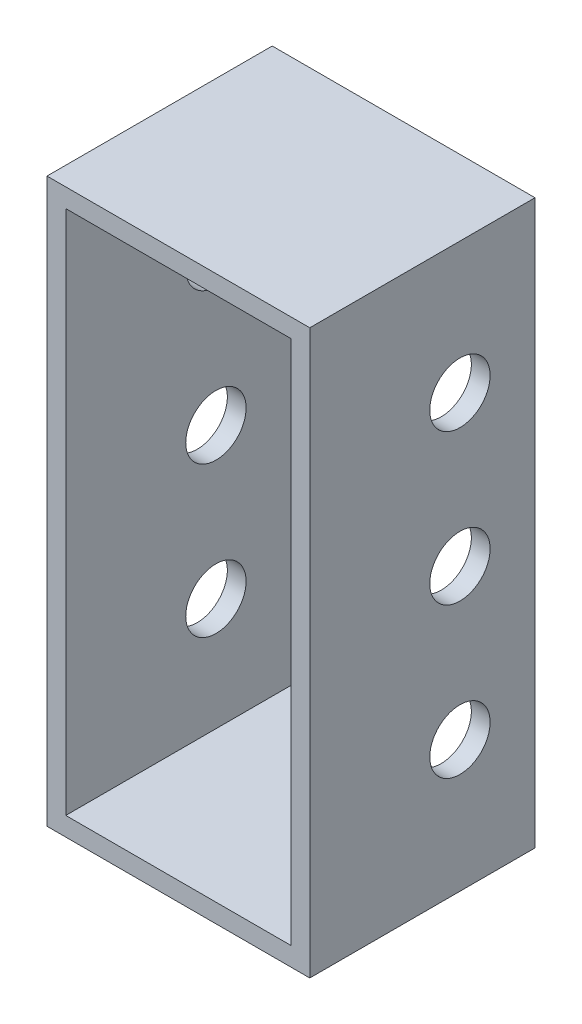
ISO-10303-21;
HEADER;
FILE_DESCRIPTION(('STEP AP214'),'2;1');
FILE_NAME('part.step','',(''),(''),'','','');
FILE_SCHEMA(('AUTOMOTIVE_DESIGN { 1 0 10303 214 1 1 1 1 }'));
ENDSEC;
DATA;
#1=APPLICATION_CONTEXT('core data for automotive mechanical design processes');
#2=APPLICATION_PROTOCOL_DEFINITION('international standard','automotive_design',2000,#1);
#3=PRODUCT_CONTEXT('',#1,'mechanical');
#4=PRODUCT('Part','Part','',(#3));
#5=PRODUCT_RELATED_PRODUCT_CATEGORY('part','',(#4));
#6=PRODUCT_DEFINITION_FORMATION('','',#4);
#7=PRODUCT_DEFINITION_CONTEXT('part definition',#1,'design');
#8=PRODUCT_DEFINITION('design','',#6,#7);
#9=PRODUCT_DEFINITION_SHAPE('','',#8);
#10=(LENGTH_UNIT() NAMED_UNIT(*) SI_UNIT(.MILLI.,.METRE.));
#11=(NAMED_UNIT(*) PLANE_ANGLE_UNIT() SI_UNIT($,.RADIAN.));
#12=(NAMED_UNIT(*) SI_UNIT($,.STERADIAN.) SOLID_ANGLE_UNIT());
#13=UNCERTAINTY_MEASURE_WITH_UNIT(LENGTH_MEASURE(1.E-05),#10,'distance_accuracy_value','');
#14=(GEOMETRIC_REPRESENTATION_CONTEXT(3) GLOBAL_UNCERTAINTY_ASSIGNED_CONTEXT((#13)) GLOBAL_UNIT_ASSIGNED_CONTEXT((#10,
#11,#12)) REPRESENTATION_CONTEXT('',''));
#15=CARTESIAN_POINT('',(0.,0.,0.));
#16=DIRECTION('',(0.,0.,1.));
#17=DIRECTION('',(1.,0.,0.));
#18=AXIS2_PLACEMENT_3D('',#15,#16,#17);
#19=CARTESIAN_POINT('',(0.,23.8125,0.));
#20=DIRECTION('',(0.,0.,-1.));
#21=DIRECTION('',(-1.,0.,0.));
#22=AXIS2_PLACEMENT_3D('',#19,#20,#21);
#23=PLANE('',#22);
#24=DIRECTION('',(1.,0.,0.));
#25=VECTOR('',#24,1.);
#26=CARTESIAN_POINT('',(0.,-23.8125,0.));
#27=LINE('',#26,#25);
#28=CARTESIAN_POINT('',(0.,-23.8125,0.));
#29=VERTEX_POINT('',#28);
#30=CARTESIAN_POINT('',(22.225,-23.8125,0.));
#31=VERTEX_POINT('',#30);
#32=EDGE_CURVE('E177',#29,#31,#27,.T.);
#33=ORIENTED_EDGE('',*,*,#32,.T.);
#34=DIRECTION('',(0.,-1.,0.));
#35=VECTOR('',#34,1.);
#36=CARTESIAN_POINT('',(22.225,23.8125,0.));
#37=LINE('',#36,#35);
#38=CARTESIAN_POINT('',(22.225,23.8125,0.));
#39=VERTEX_POINT('',#38);
#40=EDGE_CURVE('E42',#39,#31,#37,.T.);
#41=ORIENTED_EDGE('',*,*,#40,.F.);
#42=DIRECTION('',(1.,0.,0.));
#43=VECTOR('',#42,1.);
#44=CARTESIAN_POINT('',(0.,23.8125,0.));
#45=LINE('',#44,#43);
#46=CARTESIAN_POINT('',(0.,23.8125,0.));
#47=VERTEX_POINT('',#46);
#48=EDGE_CURVE('E167',#47,#39,#45,.T.);
#49=ORIENTED_EDGE('',*,*,#48,.F.);
#50=DIRECTION('',(0.,-1.,0.));
#51=VECTOR('',#50,1.);
#52=CARTESIAN_POINT('',(0.,23.8125,0.));
#53=LINE('',#52,#51);
#54=EDGE_CURVE('E11',#47,#29,#53,.T.);
#55=ORIENTED_EDGE('',*,*,#54,.T.);
#56=EDGE_LOOP('',(#33,#41,#49,#55));
#57=FACE_BOUND('',#56,.T.);
#58=DIRECTION('',(1.,0.,0.));
#59=VECTOR('',#58,1.);
#60=CARTESIAN_POINT('',(0.,-22.225,0.));
#61=LINE('',#60,#59);
#62=CARTESIAN_POINT('',(1.5875,-22.225,0.));
#63=VERTEX_POINT('',#62);
#64=CARTESIAN_POINT('',(20.6375,-22.225,0.));
#65=VERTEX_POINT('',#64);
#66=EDGE_CURVE('E112',#63,#65,#61,.T.);
#67=ORIENTED_EDGE('',*,*,#66,.F.);
#68=DIRECTION('',(0.,-1.,0.));
#69=VECTOR('',#68,1.);
#70=CARTESIAN_POINT('',(1.5875,23.8125,0.));
#71=LINE('',#70,#69);
#72=CARTESIAN_POINT('',(1.5875,22.225,0.));
#73=VERTEX_POINT('',#72);
#74=EDGE_CURVE('E99',#73,#63,#71,.T.);
#75=ORIENTED_EDGE('',*,*,#74,.F.);
#76=DIRECTION('',(1.,0.,0.));
#77=VECTOR('',#76,1.);
#78=CARTESIAN_POINT('',(0.,22.225,0.));
#79=LINE('',#78,#77);
#80=CARTESIAN_POINT('',(20.6375,22.225,0.));
#81=VERTEX_POINT('',#80);
#82=EDGE_CURVE('E126',#73,#81,#79,.T.);
#83=ORIENTED_EDGE('',*,*,#82,.T.);
#84=DIRECTION('',(0.,-1.,0.));
#85=VECTOR('',#84,1.);
#86=CARTESIAN_POINT('',(20.6375,23.8125,0.));
#87=LINE('',#86,#85);
#88=EDGE_CURVE('E108',#81,#65,#87,.T.);
#89=ORIENTED_EDGE('',*,*,#88,.T.);
#90=EDGE_LOOP('',(#67,#75,#83,#89));
#91=FACE_BOUND('',#90,.T.);
#92=ADVANCED_FACE('F34',(#57,#91),#23,.F.);
#93=CARTESIAN_POINT('',(0.,23.8125,-19.05));
#94=DIRECTION('',(0.,0.,1.));
#95=DIRECTION('',(1.,0.,0.));
#96=AXIS2_PLACEMENT_3D('',#93,#94,#95);
#97=PLANE('',#96);
#98=DIRECTION('',(-1.,0.,0.));
#99=VECTOR('',#98,1.);
#100=CARTESIAN_POINT('',(0.,-23.8125,-19.05));
#101=LINE('',#100,#99);
#102=CARTESIAN_POINT('',(22.225,-23.8125,-19.05));
#103=VERTEX_POINT('',#102);
#104=CARTESIAN_POINT('',(0.,-23.8125,-19.05));
#105=VERTEX_POINT('',#104);
#106=EDGE_CURVE('E168',#103,#105,#101,.T.);
#107=ORIENTED_EDGE('',*,*,#106,.T.);
#108=DIRECTION('',(0.,-1.,0.));
#109=VECTOR('',#108,1.);
#110=CARTESIAN_POINT('',(0.,23.8125,-19.05));
#111=LINE('',#110,#109);
#112=CARTESIAN_POINT('',(0.,23.8125,-19.05));
#113=VERTEX_POINT('',#112);
#114=EDGE_CURVE('E174',#113,#105,#111,.T.);
#115=ORIENTED_EDGE('',*,*,#114,.F.);
#116=DIRECTION('',(-1.,0.,0.));
#117=VECTOR('',#116,1.);
#118=CARTESIAN_POINT('',(0.,23.8125,-19.05));
#119=LINE('',#118,#117);
#120=CARTESIAN_POINT('',(22.225,23.8125,-19.05));
#121=VERTEX_POINT('',#120);
#122=EDGE_CURVE('E172',#121,#113,#119,.T.);
#123=ORIENTED_EDGE('',*,*,#122,.F.);
#124=DIRECTION('',(0.,-1.,0.));
#125=VECTOR('',#124,1.);
#126=CARTESIAN_POINT('',(22.225,23.8125,-19.05));
#127=LINE('',#126,#125);
#128=EDGE_CURVE('E184',#121,#103,#127,.T.);
#129=ORIENTED_EDGE('',*,*,#128,.T.);
#130=EDGE_LOOP('',(#107,#115,#123,#129));
#131=FACE_BOUND('',#130,.T.);
#132=DIRECTION('',(-1.,0.,0.));
#133=VECTOR('',#132,1.);
#134=CARTESIAN_POINT('',(0.,-22.225,-19.05));
#135=LINE('',#134,#133);
#136=CARTESIAN_POINT('',(20.6375,-22.225,-19.05));
#137=VERTEX_POINT('',#136);
#138=CARTESIAN_POINT('',(1.5875,-22.225,-19.05));
#139=VERTEX_POINT('',#138);
#140=EDGE_CURVE('E115',#137,#139,#135,.T.);
#141=ORIENTED_EDGE('',*,*,#140,.F.);
#142=DIRECTION('',(0.,-1.,0.));
#143=VECTOR('',#142,1.);
#144=CARTESIAN_POINT('',(20.6375,23.8125,-19.05));
#145=LINE('',#144,#143);
#146=CARTESIAN_POINT('',(20.6375,22.225,-19.05));
#147=VERTEX_POINT('',#146);
#148=EDGE_CURVE('E125',#147,#137,#145,.T.);
#149=ORIENTED_EDGE('',*,*,#148,.F.);
#150=DIRECTION('',(-1.,0.,0.));
#151=VECTOR('',#150,1.);
#152=CARTESIAN_POINT('',(0.,22.225,-19.05));
#153=LINE('',#152,#151);
#154=CARTESIAN_POINT('',(1.5875,22.225,-19.05));
#155=VERTEX_POINT('',#154);
#156=EDGE_CURVE('E56',#147,#155,#153,.T.);
#157=ORIENTED_EDGE('',*,*,#156,.T.);
#158=DIRECTION('',(0.,-1.,0.));
#159=VECTOR('',#158,1.);
#160=CARTESIAN_POINT('',(1.5875,23.8125,-19.05));
#161=LINE('',#160,#159);
#162=EDGE_CURVE('E129',#155,#139,#161,.T.);
#163=ORIENTED_EDGE('',*,*,#162,.T.);
#164=EDGE_LOOP('',(#141,#149,#157,#163));
#165=FACE_BOUND('',#164,.T.);
#166=ADVANCED_FACE('F200',(#131,#165),#97,.F.);
#167=CARTESIAN_POINT('',(22.225,0.,-12.7));
#168=DIRECTION('',(-1.,0.,0.));
#169=DIRECTION('',(0.,0.,1.));
#170=AXIS2_PLACEMENT_3D('',#167,#168,#169);
#171=CYLINDRICAL_SURFACE('',#170,2.5527);
#172=CARTESIAN_POINT('',(0.,0.,-12.7));
#173=DIRECTION('',(-1.,0.,0.));
#174=DIRECTION('',(0.,0.,1.));
#175=AXIS2_PLACEMENT_3D('',#172,#173,#174);
#176=CIRCLE('',#175,2.5527);
#177=CARTESIAN_POINT('',(0.,0.,-10.1473));
#178=VERTEX_POINT('',#177);
#179=EDGE_CURVE('E107',#178,#178,#176,.T.);
#180=ORIENTED_EDGE('',*,*,#179,.T.);
#181=EDGE_LOOP('',(#180));
#182=FACE_BOUND('',#181,.T.);
#183=CARTESIAN_POINT('',(1.5875,0.,-12.7));
#184=DIRECTION('',(1.,0.,0.));
#185=DIRECTION('',(0.,0.,-1.));
#186=AXIS2_PLACEMENT_3D('',#183,#184,#185);
#187=CIRCLE('',#186,2.5527);
#188=CARTESIAN_POINT('',(1.5875,0.,-15.2527));
#189=VERTEX_POINT('',#188);
#190=EDGE_CURVE('E145',#189,#189,#187,.F.);
#191=ORIENTED_EDGE('',*,*,#190,.F.);
#192=EDGE_LOOP('',(#191));
#193=FACE_BOUND('',#192,.T.);
#194=ADVANCED_FACE('F212',(#182,#193),#171,.F.);
#195=CARTESIAN_POINT('',(22.225,-12.7,-12.7));
#196=DIRECTION('',(-1.,0.,0.));
#197=DIRECTION('',(0.,0.,1.));
#198=AXIS2_PLACEMENT_3D('',#195,#196,#197);
#199=CYLINDRICAL_SURFACE('',#198,2.5527);
#200=CARTESIAN_POINT('',(0.,-12.7,-12.7));
#201=DIRECTION('',(-1.,0.,0.));
#202=DIRECTION('',(0.,0.,1.));
#203=AXIS2_PLACEMENT_3D('',#200,#201,#202);
#204=CIRCLE('',#203,2.5527);
#205=CARTESIAN_POINT('',(0.,-12.7,-10.1473));
#206=VERTEX_POINT('',#205);
#207=EDGE_CURVE('E156',#206,#206,#204,.T.);
#208=ORIENTED_EDGE('',*,*,#207,.T.);
#209=EDGE_LOOP('',(#208));
#210=FACE_BOUND('',#209,.T.);
#211=CARTESIAN_POINT('',(1.5875,-12.7,-12.7));
#212=DIRECTION('',(1.,0.,0.));
#213=DIRECTION('',(0.,0.,-1.));
#214=AXIS2_PLACEMENT_3D('',#211,#212,#213);
#215=CIRCLE('',#214,2.5527);
#216=CARTESIAN_POINT('',(1.5875,-12.7,-15.2527));
#217=VERTEX_POINT('',#216);
#218=EDGE_CURVE('E141',#217,#217,#215,.F.);
#219=ORIENTED_EDGE('',*,*,#218,.F.);
#220=EDGE_LOOP('',(#219));
#221=FACE_BOUND('',#220,.T.);
#222=ADVANCED_FACE('F231',(#210,#221),#199,.F.);
#223=CARTESIAN_POINT('',(22.225,12.7,-12.7));
#224=DIRECTION('',(-1.,0.,0.));
#225=DIRECTION('',(0.,0.,1.));
#226=AXIS2_PLACEMENT_3D('',#223,#224,#225);
#227=CYLINDRICAL_SURFACE('',#226,2.5527);
#228=CARTESIAN_POINT('',(0.,12.7,-12.7));
#229=DIRECTION('',(-1.,0.,0.));
#230=DIRECTION('',(0.,0.,1.));
#231=AXIS2_PLACEMENT_3D('',#228,#229,#230);
#232=CIRCLE('',#231,2.5527);
#233=CARTESIAN_POINT('',(0.,12.7,-10.1473));
#234=VERTEX_POINT('',#233);
#235=EDGE_CURVE('E150',#234,#234,#232,.T.);
#236=ORIENTED_EDGE('',*,*,#235,.T.);
#237=EDGE_LOOP('',(#236));
#238=FACE_BOUND('',#237,.T.);
#239=CARTESIAN_POINT('',(1.5875,12.7,-12.7));
#240=DIRECTION('',(1.,0.,0.));
#241=DIRECTION('',(0.,0.,-1.));
#242=AXIS2_PLACEMENT_3D('',#239,#240,#241);
#243=CIRCLE('',#242,2.5527);
#244=CARTESIAN_POINT('',(1.5875,12.7,-15.2527));
#245=VERTEX_POINT('',#244);
#246=EDGE_CURVE('E137',#245,#245,#243,.F.);
#247=ORIENTED_EDGE('',*,*,#246,.F.);
#248=EDGE_LOOP('',(#247));
#249=FACE_BOUND('',#248,.T.);
#250=ADVANCED_FACE('F235',(#238,#249),#227,.F.);
#251=CARTESIAN_POINT('',(0.,23.8125,0.));
#252=DIRECTION('',(1.,0.,0.));
#253=DIRECTION('',(0.,0.,-1.));
#254=AXIS2_PLACEMENT_3D('',#251,#252,#253);
#255=PLANE('',#254);
#256=ORIENTED_EDGE('',*,*,#235,.F.);
#257=EDGE_LOOP('',(#256));
#258=FACE_BOUND('',#257,.T.);
#259=ORIENTED_EDGE('',*,*,#207,.F.);
#260=EDGE_LOOP('',(#259));
#261=FACE_BOUND('',#260,.T.);
#262=ORIENTED_EDGE('',*,*,#179,.F.);
#263=EDGE_LOOP('',(#262));
#264=FACE_BOUND('',#263,.T.);
#265=DIRECTION('',(0.,0.,1.));
#266=VECTOR('',#265,1.);
#267=CARTESIAN_POINT('',(0.,-23.8125,0.));
#268=LINE('',#267,#266);
#269=EDGE_CURVE('E149',#105,#29,#268,.T.);
#270=ORIENTED_EDGE('',*,*,#269,.T.);
#271=ORIENTED_EDGE('',*,*,#54,.F.);
#272=DIRECTION('',(0.,0.,1.));
#273=VECTOR('',#272,1.);
#274=CARTESIAN_POINT('',(0.,23.8125,0.));
#275=LINE('',#274,#273);
#276=EDGE_CURVE('E164',#113,#47,#275,.T.);
#277=ORIENTED_EDGE('',*,*,#276,.F.);
#278=ORIENTED_EDGE('',*,*,#114,.T.);
#279=EDGE_LOOP('',(#270,#271,#277,#278));
#280=FACE_BOUND('',#279,.T.);
#281=ADVANCED_FACE('F36',(#258,#261,#264,#280),#255,.F.);
#282=CARTESIAN_POINT('',(22.225,23.8125,0.));
#283=DIRECTION('',(-1.,0.,0.));
#284=DIRECTION('',(0.,0.,1.));
#285=AXIS2_PLACEMENT_3D('',#282,#283,#284);
#286=PLANE('',#285);
#287=CARTESIAN_POINT('',(22.225,12.7,-12.7));
#288=DIRECTION('',(-1.,0.,0.));
#289=DIRECTION('',(0.,0.,1.));
#290=AXIS2_PLACEMENT_3D('',#287,#288,#289);
#291=CIRCLE('',#290,2.5527);
#292=CARTESIAN_POINT('',(22.225,12.7,-10.1473));
#293=VERTEX_POINT('',#292);
#294=EDGE_CURVE('E146',#293,#293,#291,.T.);
#295=ORIENTED_EDGE('',*,*,#294,.T.);
#296=EDGE_LOOP('',(#295));
#297=FACE_BOUND('',#296,.T.);
#298=CARTESIAN_POINT('',(22.225,-12.7,-12.7));
#299=DIRECTION('',(-1.,0.,0.));
#300=DIRECTION('',(0.,0.,1.));
#301=AXIS2_PLACEMENT_3D('',#298,#299,#300);
#302=CIRCLE('',#301,2.5527);
#303=CARTESIAN_POINT('',(22.225,-12.7,-10.1473));
#304=VERTEX_POINT('',#303);
#305=EDGE_CURVE('E153',#304,#304,#302,.T.);
#306=ORIENTED_EDGE('',*,*,#305,.T.);
#307=EDGE_LOOP('',(#306));
#308=FACE_BOUND('',#307,.T.);
#309=CARTESIAN_POINT('',(22.225,0.,-12.7));
#310=DIRECTION('',(-1.,0.,0.));
#311=DIRECTION('',(0.,0.,1.));
#312=AXIS2_PLACEMENT_3D('',#309,#310,#311);
#313=CIRCLE('',#312,2.5527);
#314=CARTESIAN_POINT('',(22.225,0.,-10.1473));
#315=VERTEX_POINT('',#314);
#316=EDGE_CURVE('E159',#315,#315,#313,.T.);
#317=ORIENTED_EDGE('',*,*,#316,.T.);
#318=EDGE_LOOP('',(#317));
#319=FACE_BOUND('',#318,.T.);
#320=DIRECTION('',(0.,0.,-1.));
#321=VECTOR('',#320,1.);
#322=CARTESIAN_POINT('',(22.225,-23.8125,0.));
#323=LINE('',#322,#321);
#324=EDGE_CURVE('E179',#31,#103,#323,.T.);
#325=ORIENTED_EDGE('',*,*,#324,.T.);
#326=ORIENTED_EDGE('',*,*,#128,.F.);
#327=DIRECTION('',(0.,0.,-1.));
#328=VECTOR('',#327,1.);
#329=CARTESIAN_POINT('',(22.225,23.8125,0.));
#330=LINE('',#329,#328);
#331=EDGE_CURVE('E170',#39,#121,#330,.T.);
#332=ORIENTED_EDGE('',*,*,#331,.F.);
#333=ORIENTED_EDGE('',*,*,#40,.T.);
#334=EDGE_LOOP('',(#325,#326,#332,#333));
#335=FACE_BOUND('',#334,.T.);
#336=ADVANCED_FACE('F191',(#297,#308,#319,#335),#286,.F.);
#337=CARTESIAN_POINT('',(0.,23.8125,0.));
#338=DIRECTION('',(0.,-1.,0.));
#339=DIRECTION('',(0.,0.,-1.));
#340=AXIS2_PLACEMENT_3D('',#337,#338,#339);
#341=PLANE('',#340);
#342=ORIENTED_EDGE('',*,*,#276,.T.);
#343=ORIENTED_EDGE('',*,*,#48,.T.);
#344=ORIENTED_EDGE('',*,*,#331,.T.);
#345=ORIENTED_EDGE('',*,*,#122,.T.);
#346=EDGE_LOOP('',(#342,#343,#344,#345));
#347=FACE_BOUND('',#346,.T.);
#348=ADVANCED_FACE('F207',(#347),#341,.F.);
#349=CARTESIAN_POINT('',(0.,-23.8125,0.));
#350=DIRECTION('',(0.,-1.,0.));
#351=DIRECTION('',(0.,0.,-1.));
#352=AXIS2_PLACEMENT_3D('',#349,#350,#351);
#353=PLANE('',#352);
#354=ORIENTED_EDGE('',*,*,#269,.F.);
#355=ORIENTED_EDGE('',*,*,#106,.F.);
#356=ORIENTED_EDGE('',*,*,#324,.F.);
#357=ORIENTED_EDGE('',*,*,#32,.F.);
#358=EDGE_LOOP('',(#354,#355,#356,#357));
#359=FACE_BOUND('',#358,.T.);
#360=ADVANCED_FACE('F197',(#359),#353,.T.);
#361=CARTESIAN_POINT('',(20.6375,0.,-12.7));
#362=DIRECTION('',(-1.,0.,0.));
#363=DIRECTION('',(0.,0.,1.));
#364=AXIS2_PLACEMENT_3D('',#361,#362,#363);
#365=CIRCLE('',#364,2.5527);
#366=CARTESIAN_POINT('',(20.6375,0.,-10.1473));
#367=VERTEX_POINT('',#366);
#368=EDGE_CURVE('E142',#367,#367,#365,.T.);
#369=ORIENTED_EDGE('',*,*,#368,.T.);
#370=EDGE_LOOP('',(#369));
#371=FACE_BOUND('',#370,.T.);
#372=ORIENTED_EDGE('',*,*,#316,.F.);
#373=EDGE_LOOP('',(#372));
#374=FACE_BOUND('',#373,.T.);
#375=ADVANCED_FACE('F220',(#371,#374),#171,.F.);
#376=CARTESIAN_POINT('',(20.6375,-12.7,-12.7));
#377=DIRECTION('',(-1.,0.,0.));
#378=DIRECTION('',(0.,0.,1.));
#379=AXIS2_PLACEMENT_3D('',#376,#377,#378);
#380=CIRCLE('',#379,2.5527);
#381=CARTESIAN_POINT('',(20.6375,-12.7,-10.1473));
#382=VERTEX_POINT('',#381);
#383=EDGE_CURVE('E138',#382,#382,#380,.T.);
#384=ORIENTED_EDGE('',*,*,#383,.T.);
#385=EDGE_LOOP('',(#384));
#386=FACE_BOUND('',#385,.T.);
#387=ORIENTED_EDGE('',*,*,#305,.F.);
#388=EDGE_LOOP('',(#387));
#389=FACE_BOUND('',#388,.T.);
#390=ADVANCED_FACE('F225',(#386,#389),#199,.F.);
#391=CARTESIAN_POINT('',(20.6375,12.7,-12.7));
#392=DIRECTION('',(-1.,0.,0.));
#393=DIRECTION('',(0.,0.,1.));
#394=AXIS2_PLACEMENT_3D('',#391,#392,#393);
#395=CIRCLE('',#394,2.5527);
#396=CARTESIAN_POINT('',(20.6375,12.7,-10.1473));
#397=VERTEX_POINT('',#396);
#398=EDGE_CURVE('E116',#397,#397,#395,.T.);
#399=ORIENTED_EDGE('',*,*,#398,.T.);
#400=EDGE_LOOP('',(#399));
#401=FACE_BOUND('',#400,.T.);
#402=ORIENTED_EDGE('',*,*,#294,.F.);
#403=EDGE_LOOP('',(#402));
#404=FACE_BOUND('',#403,.T.);
#405=ADVANCED_FACE('F229',(#401,#404),#227,.F.);
#406=CARTESIAN_POINT('',(1.5875,23.8125,0.));
#407=DIRECTION('',(1.,0.,0.));
#408=DIRECTION('',(0.,0.,-1.));
#409=AXIS2_PLACEMENT_3D('',#406,#407,#408);
#410=PLANE('',#409);
#411=ORIENTED_EDGE('',*,*,#246,.T.);
#412=EDGE_LOOP('',(#411));
#413=FACE_BOUND('',#412,.T.);
#414=ORIENTED_EDGE('',*,*,#218,.T.);
#415=EDGE_LOOP('',(#414));
#416=FACE_BOUND('',#415,.T.);
#417=ORIENTED_EDGE('',*,*,#190,.T.);
#418=EDGE_LOOP('',(#417));
#419=FACE_BOUND('',#418,.T.);
#420=DIRECTION('',(0.,0.,1.));
#421=VECTOR('',#420,1.);
#422=CARTESIAN_POINT('',(1.5875,-22.225,0.));
#423=LINE('',#422,#421);
#424=EDGE_CURVE('E102',#139,#63,#423,.T.);
#425=ORIENTED_EDGE('',*,*,#424,.F.);
#426=ORIENTED_EDGE('',*,*,#162,.F.);
#427=DIRECTION('',(0.,0.,1.));
#428=VECTOR('',#427,1.);
#429=CARTESIAN_POINT('',(1.5875,22.225,0.));
#430=LINE('',#429,#428);
#431=EDGE_CURVE('E49',#155,#73,#430,.T.);
#432=ORIENTED_EDGE('',*,*,#431,.T.);
#433=ORIENTED_EDGE('',*,*,#74,.T.);
#434=EDGE_LOOP('',(#425,#426,#432,#433));
#435=FACE_BOUND('',#434,.T.);
#436=ADVANCED_FACE('F101',(#413,#416,#419,#435),#410,.T.);
#437=CARTESIAN_POINT('',(20.6375,23.8125,0.));
#438=DIRECTION('',(-1.,0.,0.));
#439=DIRECTION('',(0.,0.,1.));
#440=AXIS2_PLACEMENT_3D('',#437,#438,#439);
#441=PLANE('',#440);
#442=ORIENTED_EDGE('',*,*,#398,.F.);
#443=EDGE_LOOP('',(#442));
#444=FACE_BOUND('',#443,.T.);
#445=ORIENTED_EDGE('',*,*,#383,.F.);
#446=EDGE_LOOP('',(#445));
#447=FACE_BOUND('',#446,.T.);
#448=ORIENTED_EDGE('',*,*,#368,.F.);
#449=EDGE_LOOP('',(#448));
#450=FACE_BOUND('',#449,.T.);
#451=DIRECTION('',(0.,0.,-1.));
#452=VECTOR('',#451,1.);
#453=CARTESIAN_POINT('',(20.6375,-22.225,0.));
#454=LINE('',#453,#452);
#455=EDGE_CURVE('E119',#65,#137,#454,.T.);
#456=ORIENTED_EDGE('',*,*,#455,.F.);
#457=ORIENTED_EDGE('',*,*,#88,.F.);
#458=DIRECTION('',(0.,0.,-1.));
#459=VECTOR('',#458,1.);
#460=CARTESIAN_POINT('',(20.6375,22.225,0.));
#461=LINE('',#460,#459);
#462=EDGE_CURVE('E128',#81,#147,#461,.T.);
#463=ORIENTED_EDGE('',*,*,#462,.T.);
#464=ORIENTED_EDGE('',*,*,#148,.T.);
#465=EDGE_LOOP('',(#456,#457,#463,#464));
#466=FACE_BOUND('',#465,.T.);
#467=ADVANCED_FACE('F241',(#444,#447,#450,#466),#441,.T.);
#468=CARTESIAN_POINT('',(0.,22.225,0.));
#469=DIRECTION('',(0.,-1.,0.));
#470=DIRECTION('',(0.,0.,-1.));
#471=AXIS2_PLACEMENT_3D('',#468,#469,#470);
#472=PLANE('',#471);
#473=ORIENTED_EDGE('',*,*,#431,.F.);
#474=ORIENTED_EDGE('',*,*,#156,.F.);
#475=ORIENTED_EDGE('',*,*,#462,.F.);
#476=ORIENTED_EDGE('',*,*,#82,.F.);
#477=EDGE_LOOP('',(#473,#474,#475,#476));
#478=FACE_BOUND('',#477,.T.);
#479=ADVANCED_FACE('F238',(#478),#472,.T.);
#480=CARTESIAN_POINT('',(0.,-22.225,0.));
#481=DIRECTION('',(0.,-1.,0.));
#482=DIRECTION('',(0.,0.,-1.));
#483=AXIS2_PLACEMENT_3D('',#480,#481,#482);
#484=PLANE('',#483);
#485=ORIENTED_EDGE('',*,*,#424,.T.);
#486=ORIENTED_EDGE('',*,*,#66,.T.);
#487=ORIENTED_EDGE('',*,*,#455,.T.);
#488=ORIENTED_EDGE('',*,*,#140,.T.);
#489=EDGE_LOOP('',(#485,#486,#487,#488));
#490=FACE_BOUND('',#489,.T.);
#491=ADVANCED_FACE('F111',(#490),#484,.F.);
#492=CLOSED_SHELL('',(#92,#166,#194,#222,#250,#281,#336,#348,#360,#375,#390,#405,#436,#467,#479,#491));
#493=MANIFOLD_SOLID_BREP('B2',#492);
#494=ADVANCED_BREP_SHAPE_REPRESENTATION('',(#18,#493),#14);
#495=SHAPE_DEFINITION_REPRESENTATION(#9,#494);
ENDSEC;
END-ISO-10303-21;
